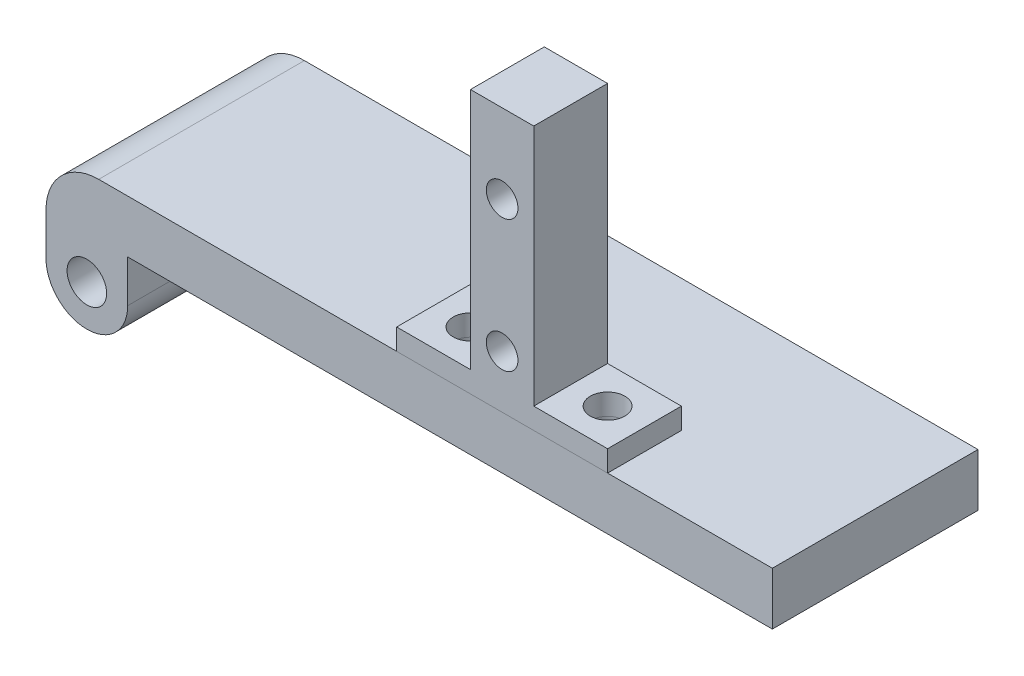
ISO-10303-21;
HEADER;
FILE_DESCRIPTION(('STEP AP214'),'2;1');
FILE_NAME('part.step','',(''),(''),'','','');
FILE_SCHEMA(('AUTOMOTIVE_DESIGN { 1 0 10303 214 1 1 1 1 }'));
ENDSEC;
DATA;
#1=APPLICATION_CONTEXT('core data for automotive mechanical design processes');
#2=APPLICATION_PROTOCOL_DEFINITION('international standard','automotive_design',2000,#1);
#3=PRODUCT_CONTEXT('',#1,'mechanical');
#4=PRODUCT('Part','Part','',(#3));
#5=PRODUCT_RELATED_PRODUCT_CATEGORY('part','',(#4));
#6=PRODUCT_DEFINITION_FORMATION('','',#4);
#7=PRODUCT_DEFINITION_CONTEXT('part definition',#1,'design');
#8=PRODUCT_DEFINITION('design','',#6,#7);
#9=PRODUCT_DEFINITION_SHAPE('','',#8);
#10=(LENGTH_UNIT() NAMED_UNIT(*) SI_UNIT(.MILLI.,.METRE.));
#11=(NAMED_UNIT(*) PLANE_ANGLE_UNIT() SI_UNIT($,.RADIAN.));
#12=(NAMED_UNIT(*) SI_UNIT($,.STERADIAN.) SOLID_ANGLE_UNIT());
#13=UNCERTAINTY_MEASURE_WITH_UNIT(LENGTH_MEASURE(1.E-05),#10,'distance_accuracy_value','');
#14=(GEOMETRIC_REPRESENTATION_CONTEXT(3) GLOBAL_UNCERTAINTY_ASSIGNED_CONTEXT((#13)) GLOBAL_UNIT_ASSIGNED_CONTEXT((#10,
#11,#12)) REPRESENTATION_CONTEXT('',''));
#15=CARTESIAN_POINT('',(0.,0.,0.));
#16=DIRECTION('',(0.,0.,1.));
#17=DIRECTION('',(1.,0.,0.));
#18=AXIS2_PLACEMENT_3D('',#15,#16,#17);
#19=CARTESIAN_POINT('',(-31.035625,3.175,24.765));
#20=DIRECTION('',(0.,1.,0.));
#21=DIRECTION('',(0.,0.,1.));
#22=AXIS2_PLACEMENT_3D('',#19,#20,#21);
#23=PLANE('',#22);
#24=DIRECTION('',(-1.,0.,0.));
#25=VECTOR('',#24,1.);
#26=CARTESIAN_POINT('',(50.0856250000001,3.175,24.765));
#27=LINE('',#26,#25);
#28=CARTESIAN_POINT('',(50.085625,3.175,24.765));
#29=VERTEX_POINT('',#28);
#30=CARTESIAN_POINT('',(-31.035625,3.175,24.765));
#31=VERTEX_POINT('',#30);
#32=EDGE_CURVE('E64',#29,#31,#27,.T.);
#33=ORIENTED_EDGE('',*,*,#32,.F.);
#34=DIRECTION('',(0.,0.,1.));
#35=VECTOR('',#34,1.);
#36=CARTESIAN_POINT('',(50.085625,3.175,0.));
#37=LINE('',#36,#35);
#38=CARTESIAN_POINT('',(50.085625,3.175,0.));
#39=VERTEX_POINT('',#38);
#40=EDGE_CURVE('E121',#39,#29,#37,.T.);
#41=ORIENTED_EDGE('',*,*,#40,.F.);
#42=DIRECTION('',(-1.,0.,0.));
#43=VECTOR('',#42,1.);
#44=CARTESIAN_POINT('',(-37.385625,3.175,0.));
#45=LINE('',#44,#43);
#46=CARTESIAN_POINT('',(-31.035625,3.175,0.));
#47=VERTEX_POINT('',#46);
#48=EDGE_CURVE('E108',#39,#47,#45,.T.);
#49=ORIENTED_EDGE('',*,*,#48,.T.);
#50=DIRECTION('',(0.,0.,-1.));
#51=VECTOR('',#50,1.);
#52=CARTESIAN_POINT('',(-31.035625,3.175,38.1));
#53=LINE('',#52,#51);
#54=EDGE_CURVE('E117',#47,#31,#53,.F.);
#55=ORIENTED_EDGE('',*,*,#54,.T.);
#56=EDGE_LOOP('',(#33,#41,#49,#55));
#57=FACE_BOUND('',#56,.T.);
#58=CARTESIAN_POINT('',(25.7968750000001,3.175,20.32));
#59=DIRECTION('',(0.,1.,0.));
#60=DIRECTION('',(0.,0.,1.));
#61=AXIS2_PLACEMENT_3D('',#58,#59,#60);
#62=CIRCLE('',#61,2.0828);
#63=CARTESIAN_POINT('',(25.7968750000001,3.175,22.4028));
#64=VERTEX_POINT('',#63);
#65=EDGE_CURVE('E50',#64,#64,#62,.F.);
#66=ORIENTED_EDGE('',*,*,#65,.T.);
#67=EDGE_LOOP('',(#66));
#68=FACE_BOUND('',#67,.T.);
#69=CARTESIAN_POINT('',(9.286875,3.175,20.32));
#70=DIRECTION('',(0.,1.,0.));
#71=DIRECTION('',(0.,0.,1.));
#72=AXIS2_PLACEMENT_3D('',#69,#70,#71);
#73=CIRCLE('',#72,2.0828);
#74=CARTESIAN_POINT('',(9.286875,3.175,22.4028));
#75=VERTEX_POINT('',#74);
#76=EDGE_CURVE('E126',#75,#75,#73,.F.);
#77=ORIENTED_EDGE('',*,*,#76,.T.);
#78=EDGE_LOOP('',(#77));
#79=FACE_BOUND('',#78,.T.);
#80=ADVANCED_FACE('F46',(#57,#68,#79),#23,.T.);
#81=CARTESIAN_POINT('',(-32.464375,-8.255,0.));
#82=DIRECTION('',(0.,0.,1.));
#83=DIRECTION('',(1.,0.,0.));
#84=AXIS2_PLACEMENT_3D('',#81,#82,#83);
#85=PLANE('',#84);
#86=DIRECTION('',(0.,-1.,0.));
#87=VECTOR('',#86,1.);
#88=CARTESIAN_POINT('',(-37.385625,-8.255,0.));
#89=LINE('',#88,#87);
#90=CARTESIAN_POINT('',(-37.385625,-3.175,0.));
#91=VERTEX_POINT('',#90);
#92=CARTESIAN_POINT('',(-37.385625,-8.255,0.));
#93=VERTEX_POINT('',#92);
#94=EDGE_CURVE('E112',#91,#93,#89,.T.);
#95=ORIENTED_EDGE('',*,*,#94,.F.);
#96=CARTESIAN_POINT('',(-31.035625,-3.175,0.));
#97=DIRECTION('',(0.,0.,1.));
#98=DIRECTION('',(1.,0.,0.));
#99=AXIS2_PLACEMENT_3D('',#96,#97,#98);
#100=CIRCLE('',#99,6.35);
#101=EDGE_CURVE('E103',#91,#47,#100,.F.);
#102=ORIENTED_EDGE('',*,*,#101,.T.);
#103=ORIENTED_EDGE('',*,*,#48,.F.);
#104=DIRECTION('',(0.,1.,0.));
#105=VECTOR('',#104,1.);
#106=CARTESIAN_POINT('',(50.085625,-3.175,0.));
#107=LINE('',#106,#105);
#108=CARTESIAN_POINT('',(50.085625,-3.175,0.));
#109=VERTEX_POINT('',#108);
#110=EDGE_CURVE('E150',#109,#39,#107,.T.);
#111=ORIENTED_EDGE('',*,*,#110,.F.);
#112=DIRECTION('',(1.,0.,0.));
#113=VECTOR('',#112,1.);
#114=CARTESIAN_POINT('',(-27.543125,-3.175,0.));
#115=LINE('',#114,#113);
#116=CARTESIAN_POINT('',(-27.543125,-3.175,0.));
#117=VERTEX_POINT('',#116);
#118=EDGE_CURVE('E137',#117,#109,#115,.T.);
#119=ORIENTED_EDGE('',*,*,#118,.F.);
#120=DIRECTION('',(0.,1.,0.));
#121=VECTOR('',#120,1.);
#122=CARTESIAN_POINT('',(-27.543125,-8.255,0.));
#123=LINE('',#122,#121);
#124=CARTESIAN_POINT('',(-27.543125,-8.255,0.));
#125=VERTEX_POINT('',#124);
#126=EDGE_CURVE('E140',#125,#117,#123,.T.);
#127=ORIENTED_EDGE('',*,*,#126,.F.);
#128=CARTESIAN_POINT('',(-32.464375,-8.255,0.));
#129=DIRECTION('',(0.,0.,1.));
#130=DIRECTION('',(1.,0.,0.));
#131=AXIS2_PLACEMENT_3D('',#128,#129,#130);
#132=CIRCLE('',#131,4.92125);
#133=EDGE_CURVE('E143',#93,#125,#132,.T.);
#134=ORIENTED_EDGE('',*,*,#133,.F.);
#135=EDGE_LOOP('',(#95,#102,#103,#111,#119,#127,#134));
#136=FACE_BOUND('',#135,.T.);
#137=CARTESIAN_POINT('',(-32.464375,-8.255,0.));
#138=DIRECTION('',(0.,0.,1.));
#139=DIRECTION('',(1.,0.,0.));
#140=AXIS2_PLACEMENT_3D('',#137,#138,#139);
#141=CIRCLE('',#140,2.38125);
#142=CARTESIAN_POINT('',(-34.845625,-8.255,0.));
#143=VERTEX_POINT('',#142);
#144=EDGE_CURVE('E122',#143,#143,#141,.T.);
#145=ORIENTED_EDGE('',*,*,#144,.T.);
#146=EDGE_LOOP('',(#145));
#147=FACE_BOUND('',#146,.T.);
#148=ADVANCED_FACE('F105',(#136,#147),#85,.F.);
#149=CARTESIAN_POINT('',(50.085625,0.,0.));
#150=DIRECTION('',(1.,0.,0.));
#151=DIRECTION('',(0.,0.,-1.));
#152=AXIS2_PLACEMENT_3D('',#149,#150,#151);
#153=PLANE('',#152);
#154=DIRECTION('',(0.,1.,0.));
#155=VECTOR('',#154,1.);
#156=CARTESIAN_POINT('',(50.085625,3.175,24.765));
#157=LINE('',#156,#155);
#158=CARTESIAN_POINT('',(50.085625,-3.175,24.765));
#159=VERTEX_POINT('',#158);
#160=EDGE_CURVE('E170',#159,#29,#157,.T.);
#161=ORIENTED_EDGE('',*,*,#160,.F.);
#162=DIRECTION('',(0.,0.,-1.));
#163=VECTOR('',#162,1.);
#164=CARTESIAN_POINT('',(50.085625,-3.175,38.1));
#165=LINE('',#164,#163);
#166=EDGE_CURVE('E152',#159,#109,#165,.T.);
#167=ORIENTED_EDGE('',*,*,#166,.T.);
#168=ORIENTED_EDGE('',*,*,#110,.T.);
#169=ORIENTED_EDGE('',*,*,#40,.T.);
#170=EDGE_LOOP('',(#161,#167,#168,#169));
#171=FACE_BOUND('',#170,.T.);
#172=ADVANCED_FACE('F178',(#171),#153,.T.);
#173=CARTESIAN_POINT('',(-27.543125,-3.175,38.1));
#174=DIRECTION('',(0.,1.,0.));
#175=DIRECTION('',(-1.,0.,0.));
#176=AXIS2_PLACEMENT_3D('',#173,#174,#175);
#177=PLANE('',#176);
#178=CARTESIAN_POINT('',(9.286875,-3.175,20.32));
#179=DIRECTION('',(0.,1.,0.));
#180=DIRECTION('',(-1.,0.,0.));
#181=AXIS2_PLACEMENT_3D('',#178,#179,#180);
#182=CIRCLE('',#181,2.0828);
#183=CARTESIAN_POINT('',(7.204075,-3.175,20.32));
#184=VERTEX_POINT('',#183);
#185=EDGE_CURVE('E157',#184,#184,#182,.T.);
#186=ORIENTED_EDGE('',*,*,#185,.T.);
#187=EDGE_LOOP('',(#186));
#188=FACE_BOUND('',#187,.T.);
#189=CARTESIAN_POINT('',(25.7968750000001,-3.175,20.32));
#190=DIRECTION('',(0.,1.,0.));
#191=DIRECTION('',(-1.,0.,0.));
#192=AXIS2_PLACEMENT_3D('',#189,#190,#191);
#193=CIRCLE('',#192,2.0828);
#194=CARTESIAN_POINT('',(23.7140750000001,-3.175,20.32));
#195=VERTEX_POINT('',#194);
#196=EDGE_CURVE('E154',#195,#195,#193,.T.);
#197=ORIENTED_EDGE('',*,*,#196,.T.);
#198=EDGE_LOOP('',(#197));
#199=FACE_BOUND('',#198,.T.);
#200=ORIENTED_EDGE('',*,*,#166,.F.);
#201=DIRECTION('',(1.,0.,0.));
#202=VECTOR('',#201,1.);
#203=CARTESIAN_POINT('',(-27.5431249999999,-3.175,24.765));
#204=LINE('',#203,#202);
#205=CARTESIAN_POINT('',(-27.543125,-3.175,24.765));
#206=VERTEX_POINT('',#205);
#207=EDGE_CURVE('E168',#206,#159,#204,.T.);
#208=ORIENTED_EDGE('',*,*,#207,.F.);
#209=DIRECTION('',(0.,0.,-1.));
#210=VECTOR('',#209,1.);
#211=CARTESIAN_POINT('',(-27.543125,-3.175,38.1));
#212=LINE('',#211,#210);
#213=EDGE_CURVE('E135',#206,#117,#212,.T.);
#214=ORIENTED_EDGE('',*,*,#213,.T.);
#215=ORIENTED_EDGE('',*,*,#118,.T.);
#216=EDGE_LOOP('',(#200,#208,#214,#215));
#217=FACE_BOUND('',#216,.T.);
#218=ADVANCED_FACE('F182',(#188,#199,#217),#177,.F.);
#219=CARTESIAN_POINT('',(25.7968750000001,-13.17625,20.32));
#220=DIRECTION('',(0.,1.,0.));
#221=DIRECTION('',(0.,0.,1.));
#222=AXIS2_PLACEMENT_3D('',#219,#220,#221);
#223=CYLINDRICAL_SURFACE('',#222,2.0828);
#224=ORIENTED_EDGE('',*,*,#196,.F.);
#225=EDGE_LOOP('',(#224));
#226=FACE_BOUND('',#225,.T.);
#227=ORIENTED_EDGE('',*,*,#65,.F.);
#228=EDGE_LOOP('',(#227));
#229=FACE_BOUND('',#228,.T.);
#230=ADVANCED_FACE('F217',(#226,#229),#223,.F.);
#231=CARTESIAN_POINT('',(9.286875,-13.17625,20.32));
#232=DIRECTION('',(0.,1.,0.));
#233=DIRECTION('',(0.,0.,1.));
#234=AXIS2_PLACEMENT_3D('',#231,#232,#233);
#235=CYLINDRICAL_SURFACE('',#234,2.0828);
#236=ORIENTED_EDGE('',*,*,#185,.F.);
#237=EDGE_LOOP('',(#236));
#238=FACE_BOUND('',#237,.T.);
#239=ORIENTED_EDGE('',*,*,#76,.F.);
#240=EDGE_LOOP('',(#239));
#241=FACE_BOUND('',#240,.T.);
#242=ADVANCED_FACE('F219',(#238,#241),#235,.F.);
#243=CARTESIAN_POINT('',(-27.543125,-8.255,38.1));
#244=DIRECTION('',(-1.,0.,0.));
#245=DIRECTION('',(0.,0.,1.));
#246=AXIS2_PLACEMENT_3D('',#243,#244,#245);
#247=PLANE('',#246);
#248=ORIENTED_EDGE('',*,*,#213,.F.);
#249=DIRECTION('',(0.,1.,0.));
#250=VECTOR('',#249,1.);
#251=CARTESIAN_POINT('',(-27.543125,-8.255,24.765));
#252=LINE('',#251,#250);
#253=CARTESIAN_POINT('',(-27.543125,-8.255,24.765));
#254=VERTEX_POINT('',#253);
#255=EDGE_CURVE('E166',#254,#206,#252,.T.);
#256=ORIENTED_EDGE('',*,*,#255,.F.);
#257=DIRECTION('',(0.,0.,-1.));
#258=VECTOR('',#257,1.);
#259=CARTESIAN_POINT('',(-27.543125,-8.255,38.1));
#260=LINE('',#259,#258);
#261=EDGE_CURVE('E133',#254,#125,#260,.T.);
#262=ORIENTED_EDGE('',*,*,#261,.T.);
#263=ORIENTED_EDGE('',*,*,#126,.T.);
#264=EDGE_LOOP('',(#248,#256,#262,#263));
#265=FACE_BOUND('',#264,.T.);
#266=ADVANCED_FACE('F186',(#265),#247,.F.);
#267=CARTESIAN_POINT('',(-32.464375,-8.255,38.1));
#268=DIRECTION('',(0.,0.,-1.));
#269=DIRECTION('',(-1.,0.,0.));
#270=AXIS2_PLACEMENT_3D('',#267,#268,#269);
#271=CYLINDRICAL_SURFACE('',#270,4.92125);
#272=ORIENTED_EDGE('',*,*,#261,.F.);
#273=CARTESIAN_POINT('',(-32.464375,-8.255,24.765));
#274=DIRECTION('',(0.,0.,-1.));
#275=DIRECTION('',(-1.,0.,0.));
#276=AXIS2_PLACEMENT_3D('',#273,#274,#275);
#277=CIRCLE('',#276,4.92125);
#278=CARTESIAN_POINT('',(-37.385625,-8.255,24.765));
#279=VERTEX_POINT('',#278);
#280=EDGE_CURVE('E164',#279,#254,#277,.F.);
#281=ORIENTED_EDGE('',*,*,#280,.F.);
#282=DIRECTION('',(0.,0.,-1.));
#283=VECTOR('',#282,1.);
#284=CARTESIAN_POINT('',(-37.385625,-8.255,38.1));
#285=LINE('',#284,#283);
#286=EDGE_CURVE('E131',#279,#93,#285,.T.);
#287=ORIENTED_EDGE('',*,*,#286,.T.);
#288=ORIENTED_EDGE('',*,*,#133,.T.);
#289=EDGE_LOOP('',(#272,#281,#287,#288));
#290=FACE_BOUND('',#289,.T.);
#291=ADVANCED_FACE('F190',(#290),#271,.T.);
#292=CARTESIAN_POINT('',(-37.385625,-8.255,38.1));
#293=DIRECTION('',(1.,0.,0.));
#294=DIRECTION('',(0.,0.,-1.));
#295=AXIS2_PLACEMENT_3D('',#292,#293,#294);
#296=PLANE('',#295);
#297=ORIENTED_EDGE('',*,*,#286,.F.);
#298=DIRECTION('',(0.,-1.,0.));
#299=VECTOR('',#298,1.);
#300=CARTESIAN_POINT('',(-37.385625,-3.175,24.765));
#301=LINE('',#300,#299);
#302=CARTESIAN_POINT('',(-37.385625,-3.175,24.765));
#303=VERTEX_POINT('',#302);
#304=EDGE_CURVE('E56',#303,#279,#301,.T.);
#305=ORIENTED_EDGE('',*,*,#304,.F.);
#306=DIRECTION('',(0.,0.,-1.));
#307=VECTOR('',#306,1.);
#308=CARTESIAN_POINT('',(-37.385625,-3.175,38.1));
#309=LINE('',#308,#307);
#310=EDGE_CURVE('E116',#303,#91,#309,.T.);
#311=ORIENTED_EDGE('',*,*,#310,.T.);
#312=ORIENTED_EDGE('',*,*,#94,.T.);
#313=EDGE_LOOP('',(#297,#305,#311,#312));
#314=FACE_BOUND('',#313,.T.);
#315=ADVANCED_FACE('F193',(#314),#296,.F.);
#316=CARTESIAN_POINT('',(-31.035625,-3.175,38.1));
#317=DIRECTION('',(0.,0.,-1.));
#318=DIRECTION('',(-1.,0.,0.));
#319=AXIS2_PLACEMENT_3D('',#316,#317,#318);
#320=CYLINDRICAL_SURFACE('',#319,6.35);
#321=CARTESIAN_POINT('',(-31.035625,-3.175,24.765));
#322=DIRECTION('',(0.,0.,-1.));
#323=DIRECTION('',(-1.,0.,0.));
#324=AXIS2_PLACEMENT_3D('',#321,#322,#323);
#325=CIRCLE('',#324,6.35);
#326=EDGE_CURVE('E13',#31,#303,#325,.F.);
#327=ORIENTED_EDGE('',*,*,#326,.F.);
#328=ORIENTED_EDGE('',*,*,#54,.F.);
#329=ORIENTED_EDGE('',*,*,#101,.F.);
#330=ORIENTED_EDGE('',*,*,#310,.F.);
#331=EDGE_LOOP('',(#327,#328,#329,#330));
#332=FACE_BOUND('',#331,.T.);
#333=ADVANCED_FACE('F125',(#332),#320,.T.);
#334=CARTESIAN_POINT('',(-32.464375,-8.255,38.1));
#335=DIRECTION('',(0.,0.,-1.));
#336=DIRECTION('',(-1.,0.,0.));
#337=AXIS2_PLACEMENT_3D('',#334,#335,#336);
#338=CYLINDRICAL_SURFACE('',#337,2.38125);
#339=CARTESIAN_POINT('',(-32.464375,-8.255,24.765));
#340=DIRECTION('',(0.,0.,-1.));
#341=DIRECTION('',(-1.,0.,0.));
#342=AXIS2_PLACEMENT_3D('',#339,#340,#341);
#343=CIRCLE('',#342,2.38125);
#344=CARTESIAN_POINT('',(-34.845625,-8.255,24.765));
#345=VERTEX_POINT('',#344);
#346=EDGE_CURVE('E160',#345,#345,#343,.T.);
#347=CARTESIAN_POINT('',(-34.845625,-8.255,24.765));
#348=CARTESIAN_POINT('',(-34.845625,-8.255,24.50703125));
#349=CARTESIAN_POINT('',(-34.845625,-8.255,24.2490625));
#350=CARTESIAN_POINT('',(-34.845625,-8.255,23.733125));
#351=CARTESIAN_POINT('',(-34.845625,-8.255,23.47515625));
#352=CARTESIAN_POINT('',(-34.845625,-8.255,22.95921875));
#353=CARTESIAN_POINT('',(-34.845625,-8.255,22.70125));
#354=CARTESIAN_POINT('',(-34.845625,-8.255,22.1853125));
#355=CARTESIAN_POINT('',(-34.845625,-8.255,21.92734375));
#356=CARTESIAN_POINT('',(-34.845625,-8.255,21.41140625));
#357=CARTESIAN_POINT('',(-34.845625,-8.255,21.1534375));
#358=CARTESIAN_POINT('',(-34.845625,-8.255,20.6375));
#359=CARTESIAN_POINT('',(-34.845625,-8.255,20.37953125));
#360=CARTESIAN_POINT('',(-34.845625,-8.255,19.86359375));
#361=CARTESIAN_POINT('',(-34.845625,-8.255,19.605625));
#362=CARTESIAN_POINT('',(-34.845625,-8.255,19.0896875));
#363=CARTESIAN_POINT('',(-34.845625,-8.255,18.83171875));
#364=CARTESIAN_POINT('',(-34.845625,-8.255,18.31578125));
#365=CARTESIAN_POINT('',(-34.845625,-8.255,18.0578125));
#366=CARTESIAN_POINT('',(-34.845625,-8.255,17.541875));
#367=CARTESIAN_POINT('',(-34.845625,-8.255,17.28390625));
#368=CARTESIAN_POINT('',(-34.845625,-8.255,16.76796875));
#369=CARTESIAN_POINT('',(-34.845625,-8.255,16.51));
#370=CARTESIAN_POINT('',(-34.845625,-8.255,15.9940625));
#371=CARTESIAN_POINT('',(-34.845625,-8.255,15.73609375));
#372=CARTESIAN_POINT('',(-34.845625,-8.255,15.22015625));
#373=CARTESIAN_POINT('',(-34.845625,-8.255,14.9621875));
#374=CARTESIAN_POINT('',(-34.845625,-8.255,14.44625));
#375=CARTESIAN_POINT('',(-34.845625,-8.255,14.18828125));
#376=CARTESIAN_POINT('',(-34.845625,-8.255,13.67234375));
#377=CARTESIAN_POINT('',(-34.845625,-8.255,13.414375));
#378=CARTESIAN_POINT('',(-34.845625,-8.255,12.8984375));
#379=CARTESIAN_POINT('',(-34.845625,-8.255,12.64046875));
#380=CARTESIAN_POINT('',(-34.845625,-8.255,12.12453125));
#381=CARTESIAN_POINT('',(-34.845625,-8.255,11.8665625));
#382=CARTESIAN_POINT('',(-34.845625,-8.255,11.350625));
#383=CARTESIAN_POINT('',(-34.845625,-8.255,11.09265625));
#384=CARTESIAN_POINT('',(-34.845625,-8.255,10.57671875));
#385=CARTESIAN_POINT('',(-34.845625,-8.255,10.31875));
#386=CARTESIAN_POINT('',(-34.845625,-8.255,9.80281250000001));
#387=CARTESIAN_POINT('',(-34.845625,-8.255,9.54484375000001));
#388=CARTESIAN_POINT('',(-34.845625,-8.255,9.02890625000001));
#389=CARTESIAN_POINT('',(-34.845625,-8.255,8.77093750000001));
#390=CARTESIAN_POINT('',(-34.845625,-8.255,8.25500000000001));
#391=CARTESIAN_POINT('',(-34.845625,-8.255,7.99703125000001));
#392=CARTESIAN_POINT('',(-34.845625,-8.255,7.48109375000001));
#393=CARTESIAN_POINT('',(-34.845625,-8.255,7.22312500000001));
#394=CARTESIAN_POINT('',(-34.845625,-8.255,6.70718750000001));
#395=CARTESIAN_POINT('',(-34.845625,-8.255,6.44921875000001));
#396=CARTESIAN_POINT('',(-34.845625,-8.255,5.93328125000001));
#397=CARTESIAN_POINT('',(-34.845625,-8.255,5.67531250000001));
#398=CARTESIAN_POINT('',(-34.845625,-8.255,5.15937500000001));
#399=CARTESIAN_POINT('',(-34.845625,-8.255,4.90140625000001));
#400=CARTESIAN_POINT('',(-34.845625,-8.255,4.38546875000001));
#401=CARTESIAN_POINT('',(-34.845625,-8.255,4.1275));
#402=CARTESIAN_POINT('',(-34.845625,-8.255,3.6115625));
#403=CARTESIAN_POINT('',(-34.845625,-8.255,3.35359375));
#404=CARTESIAN_POINT('',(-34.845625,-8.255,2.83765625000001));
#405=CARTESIAN_POINT('',(-34.845625,-8.255,2.57968750000001));
#406=CARTESIAN_POINT('',(-34.845625,-8.255,2.06375000000001));
#407=CARTESIAN_POINT('',(-34.845625,-8.255,1.80578125));
#408=CARTESIAN_POINT('',(-34.845625,-8.255,1.28984375));
#409=CARTESIAN_POINT('',(-34.845625,-8.255,1.031875));
#410=CARTESIAN_POINT('',(-34.845625,-8.255,0.515937499999998));
#411=CARTESIAN_POINT('',(-34.845625,-8.255,0.257968749999999));
#412=CARTESIAN_POINT('',(-34.845625,-8.255,0.));
#413=B_SPLINE_CURVE_WITH_KNOTS('',3,(#347,#348,#349,#350,#351,#352,#353,#354,#355,#356,#357,
#358,#359,#360,#361,#362,#363,#364,#365,#366,#367,#368,#369,#370,#371,#372,#373,#374,#375,#376,
#377,#378,#379,#380,#381,#382,#383,#384,#385,#386,#387,#388,#389,#390,#391,#392,#393,#394,#395,
#396,#397,#398,#399,#400,#401,#402,#403,#404,#405,#406,#407,#408,#409,#410,#411,#412),
.UNSPECIFIED.,.F.,.F.,(4,2,2,2,2,2,2,2,2,2,2,2,2,2,2,2,2,2,2,2,2,2,2,2,2,2,2,2,2,2,2,2,4),(0.,
0.773906250000005,1.5478125,2.32171875,3.095625,3.86953125000001,4.64343750000001,
5.41734375000001,6.19125000000001,6.96515625000001,7.73906250000001,8.51296875000001,
9.28687500000001,10.06078125,10.8346875,11.60859375,12.3825,13.15640625,13.9303125,14.70421875,
15.478125,16.25203125,17.0259375,17.79984375,18.57375,19.34765625,20.1215625,20.89546875,
21.669375,22.44328125,23.2171875,23.99109375,24.765),.UNSPECIFIED.);
#414=EDGE_CURVE('BSEAM200',#345,#143,#413,.T.);
#415=ORIENTED_EDGE('',*,*,#346,.F.);
#416=ORIENTED_EDGE('',*,*,#144,.F.);
#417=ORIENTED_EDGE('',*,*,#414,.T.);
#418=ORIENTED_EDGE('',*,*,#414,.F.);
#419=EDGE_LOOP('',(#415,#417,#416,#418));
#420=FACE_BOUND('',#419,.T.);
#421=ADVANCED_FACE('F200',(#420),#338,.F.);
#422=CARTESIAN_POINT('',(21.351875,34.925,24.765));
#423=DIRECTION('',(0.,0.,-1.));
#424=DIRECTION('',(-1.,0.,0.));
#425=AXIS2_PLACEMENT_3D('',#422,#423,#424);
#426=PLANE('',#425);
#427=ORIENTED_EDGE('',*,*,#346,.T.);
#428=EDGE_LOOP('',(#427));
#429=FACE_BOUND('',#428,.T.);
#430=ORIENTED_EDGE('',*,*,#160,.T.);
#431=ORIENTED_EDGE('',*,*,#32,.T.);
#432=ORIENTED_EDGE('',*,*,#326,.T.);
#433=ORIENTED_EDGE('',*,*,#304,.T.);
#434=ORIENTED_EDGE('',*,*,#280,.T.);
#435=ORIENTED_EDGE('',*,*,#255,.T.);
#436=ORIENTED_EDGE('',*,*,#207,.T.);
#437=EDGE_LOOP('',(#430,#431,#432,#433,#434,#435,#436));
#438=FACE_BOUND('',#437,.T.);
#439=ADVANCED_FACE('F48',(#429,#438),#426,.F.);
#440=CLOSED_SHELL('',(#80,#148,#172,#218,#230,#242,#266,#291,#315,#333,#421,#439));
#441=MANIFOLD_SOLID_BREP('B2',#440);
#442=CARTESIAN_POINT('',(-31.035625,3.175,24.765));
#443=DIRECTION('',(0.,1.,0.));
#444=DIRECTION('',(0.,0.,1.));
#445=AXIS2_PLACEMENT_3D('',#442,#443,#444);
#446=PLANE('',#445);
#447=CARTESIAN_POINT('',(9.286875,3.175,20.32));
#448=DIRECTION('',(0.,1.,0.));
#449=DIRECTION('',(0.,0.,1.));
#450=AXIS2_PLACEMENT_3D('',#447,#448,#449);
#451=CIRCLE('',#450,2.0828);
#452=CARTESIAN_POINT('',(9.286875,3.175,22.4028));
#453=VERTEX_POINT('',#452);
#454=EDGE_CURVE('E342',#453,#453,#451,.F.);
#455=ORIENTED_EDGE('',*,*,#454,.F.);
#456=EDGE_LOOP('',(#455));
#457=FACE_BOUND('',#456,.T.);
#458=CARTESIAN_POINT('',(25.7968750000001,3.175,20.32));
#459=DIRECTION('',(0.,1.,0.));
#460=DIRECTION('',(0.,0.,1.));
#461=AXIS2_PLACEMENT_3D('',#458,#459,#460);
#462=CIRCLE('',#461,2.0828);
#463=CARTESIAN_POINT('',(25.7968750000001,3.175,22.4028));
#464=VERTEX_POINT('',#463);
#465=EDGE_CURVE('E458',#464,#464,#462,.F.);
#466=ORIENTED_EDGE('',*,*,#465,.F.);
#467=EDGE_LOOP('',(#466));
#468=FACE_BOUND('',#467,.T.);
#469=DIRECTION('',(1.,0.,0.));
#470=VECTOR('',#469,1.);
#471=CARTESIAN_POINT('',(21.351875,3.175,24.765));
#472=LINE('',#471,#470);
#473=CARTESIAN_POINT('',(4.84187500000001,3.175,24.765));
#474=VERTEX_POINT('',#473);
#475=CARTESIAN_POINT('',(30.241875,3.175,24.765));
#476=VERTEX_POINT('',#475);
#477=EDGE_CURVE('E44',#474,#476,#472,.T.);
#478=ORIENTED_EDGE('',*,*,#477,.F.);
#479=DIRECTION('',(0.,0.,1.));
#480=VECTOR('',#479,1.);
#481=CARTESIAN_POINT('',(4.841875,3.175,24.765));
#482=LINE('',#481,#480);
#483=CARTESIAN_POINT('',(4.841875,3.175,15.875));
#484=VERTEX_POINT('',#483);
#485=EDGE_CURVE('E400',#484,#474,#482,.T.);
#486=ORIENTED_EDGE('',*,*,#485,.F.);
#487=DIRECTION('',(-1.,0.,0.));
#488=VECTOR('',#487,1.);
#489=CARTESIAN_POINT('',(21.351875,3.175,15.875));
#490=LINE('',#489,#488);
#491=CARTESIAN_POINT('',(30.241875,3.175,15.875));
#492=VERTEX_POINT('',#491);
#493=EDGE_CURVE('E436',#492,#484,#490,.T.);
#494=ORIENTED_EDGE('',*,*,#493,.F.);
#495=DIRECTION('',(0.,0.,-1.));
#496=VECTOR('',#495,1.);
#497=CARTESIAN_POINT('',(30.241875,3.175,24.765));
#498=LINE('',#497,#496);
#499=EDGE_CURVE('E410',#476,#492,#498,.T.);
#500=ORIENTED_EDGE('',*,*,#499,.F.);
#501=EDGE_LOOP('',(#478,#486,#494,#500));
#502=FACE_BOUND('',#501,.T.);
#503=ADVANCED_FACE('F335',(#457,#468,#502),#446,.F.);
#504=CARTESIAN_POINT('',(0.,34.925,0.));
#505=DIRECTION('',(0.,1.,0.));
#506=DIRECTION('',(0.,0.,1.));
#507=AXIS2_PLACEMENT_3D('',#504,#505,#506);
#508=PLANE('',#507);
#509=DIRECTION('',(0.,0.,1.));
#510=VECTOR('',#509,1.);
#511=CARTESIAN_POINT('',(13.731875,34.925,24.765));
#512=LINE('',#511,#510);
#513=CARTESIAN_POINT('',(13.731875,34.925,15.875));
#514=VERTEX_POINT('',#513);
#515=CARTESIAN_POINT('',(13.731875,34.925,24.765));
#516=VERTEX_POINT('',#515);
#517=EDGE_CURVE('E437',#514,#516,#512,.T.);
#518=ORIENTED_EDGE('',*,*,#517,.T.);
#519=DIRECTION('',(1.,0.,0.));
#520=VECTOR('',#519,1.);
#521=CARTESIAN_POINT('',(21.351875,34.925,24.765));
#522=LINE('',#521,#520);
#523=CARTESIAN_POINT('',(21.351875,34.925,24.765));
#524=VERTEX_POINT('',#523);
#525=EDGE_CURVE('E440',#516,#524,#522,.T.);
#526=ORIENTED_EDGE('',*,*,#525,.T.);
#527=DIRECTION('',(0.,0.,-1.));
#528=VECTOR('',#527,1.);
#529=CARTESIAN_POINT('',(21.351875,34.925,24.765));
#530=LINE('',#529,#528);
#531=CARTESIAN_POINT('',(21.351875,34.925,15.875));
#532=VERTEX_POINT('',#531);
#533=EDGE_CURVE('E442',#524,#532,#530,.T.);
#534=ORIENTED_EDGE('',*,*,#533,.T.);
#535=DIRECTION('',(-1.,0.,0.));
#536=VECTOR('',#535,1.);
#537=CARTESIAN_POINT('',(21.351875,34.925,15.875));
#538=LINE('',#537,#536);
#539=EDGE_CURVE('E444',#532,#514,#538,.T.);
#540=ORIENTED_EDGE('',*,*,#539,.T.);
#541=EDGE_LOOP('',(#518,#526,#534,#540));
#542=FACE_BOUND('',#541,.T.);
#543=ADVANCED_FACE('F477',(#542),#508,.T.);
#544=CARTESIAN_POINT('',(13.731875,34.925,24.765));
#545=DIRECTION('',(1.,0.,0.));
#546=DIRECTION('',(0.,0.,-1.));
#547=AXIS2_PLACEMENT_3D('',#544,#545,#546);
#548=PLANE('',#547);
#549=DIRECTION('',(0.,-1.,0.));
#550=VECTOR('',#549,1.);
#551=CARTESIAN_POINT('',(13.731875,34.925,15.875));
#552=LINE('',#551,#550);
#553=CARTESIAN_POINT('',(13.731875,5.715,15.875));
#554=VERTEX_POINT('',#553);
#555=EDGE_CURVE('E446',#514,#554,#552,.T.);
#556=ORIENTED_EDGE('',*,*,#555,.T.);
#557=DIRECTION('',(0.,0.,1.));
#558=VECTOR('',#557,1.);
#559=CARTESIAN_POINT('',(13.731875,5.715,24.765));
#560=LINE('',#559,#558);
#561=CARTESIAN_POINT('',(13.731875,5.715,24.765));
#562=VERTEX_POINT('',#561);
#563=EDGE_CURVE('E421',#554,#562,#560,.T.);
#564=ORIENTED_EDGE('',*,*,#563,.T.);
#565=DIRECTION('',(0.,-1.,0.));
#566=VECTOR('',#565,1.);
#567=CARTESIAN_POINT('',(13.731875,34.925,24.765));
#568=LINE('',#567,#566);
#569=EDGE_CURVE('E456',#516,#562,#568,.T.);
#570=ORIENTED_EDGE('',*,*,#569,.F.);
#571=ORIENTED_EDGE('',*,*,#517,.F.);
#572=EDGE_LOOP('',(#556,#564,#570,#571));
#573=FACE_BOUND('',#572,.T.);
#574=ADVANCED_FACE('F509',(#573),#548,.F.);
#575=CARTESIAN_POINT('',(21.351875,34.925,24.765));
#576=DIRECTION('',(-1.,0.,0.));
#577=DIRECTION('',(0.,0.,1.));
#578=AXIS2_PLACEMENT_3D('',#575,#576,#577);
#579=PLANE('',#578);
#580=DIRECTION('',(0.,-1.,0.));
#581=VECTOR('',#580,1.);
#582=CARTESIAN_POINT('',(21.351875,34.925,24.765));
#583=LINE('',#582,#581);
#584=CARTESIAN_POINT('',(21.351875,5.715,24.765));
#585=VERTEX_POINT('',#584);
#586=EDGE_CURVE('E453',#524,#585,#583,.T.);
#587=ORIENTED_EDGE('',*,*,#586,.T.);
#588=DIRECTION('',(0.,0.,-1.));
#589=VECTOR('',#588,1.);
#590=CARTESIAN_POINT('',(21.351875,5.715,24.765));
#591=LINE('',#590,#589);
#592=CARTESIAN_POINT('',(21.351875,5.715,15.875));
#593=VERTEX_POINT('',#592);
#594=EDGE_CURVE('E418',#585,#593,#591,.T.);
#595=ORIENTED_EDGE('',*,*,#594,.T.);
#596=DIRECTION('',(0.,-1.,0.));
#597=VECTOR('',#596,1.);
#598=CARTESIAN_POINT('',(21.351875,34.925,15.875));
#599=LINE('',#598,#597);
#600=EDGE_CURVE('E450',#532,#593,#599,.T.);
#601=ORIENTED_EDGE('',*,*,#600,.F.);
#602=ORIENTED_EDGE('',*,*,#533,.F.);
#603=EDGE_LOOP('',(#587,#595,#601,#602));
#604=FACE_BOUND('',#603,.T.);
#605=ADVANCED_FACE('F502',(#604),#579,.F.);
#606=CARTESIAN_POINT('',(17.541875,25.4,0.));
#607=DIRECTION('',(0.,0.,1.));
#608=DIRECTION('',(1.,0.,0.));
#609=AXIS2_PLACEMENT_3D('',#606,#607,#608);
#610=CYLINDRICAL_SURFACE('',#609,1.905);
#611=CARTESIAN_POINT('',(17.541875,25.4,15.875));
#612=DIRECTION('',(0.,0.,1.));
#613=DIRECTION('',(1.,0.,0.));
#614=AXIS2_PLACEMENT_3D('',#611,#612,#613);
#615=CIRCLE('',#614,1.905);
#616=CARTESIAN_POINT('',(19.446875,25.4,15.875));
#617=VERTEX_POINT('',#616);
#618=EDGE_CURVE('E428',#617,#617,#615,.T.);
#619=CARTESIAN_POINT('',(17.541875,25.4,24.765));
#620=DIRECTION('',(0.,0.,-1.));
#621=DIRECTION('',(-1.,0.,0.));
#622=AXIS2_PLACEMENT_3D('',#619,#620,#621);
#623=CIRCLE('',#622,1.905);
#624=CARTESIAN_POINT('',(19.446875,25.4,24.765));
#625=VERTEX_POINT('',#624);
#626=EDGE_CURVE('E429',#625,#625,#623,.T.);
#627=CARTESIAN_POINT('',(19.446875,25.4,15.875));
#628=CARTESIAN_POINT('',(19.446875,25.4,15.9676041666667));
#629=CARTESIAN_POINT('',(19.446875,25.4,16.0602083333333));
#630=CARTESIAN_POINT('',(19.446875,25.4,16.2454166666667));
#631=CARTESIAN_POINT('',(19.446875,25.4,16.3380208333333));
#632=CARTESIAN_POINT('',(19.446875,25.4,16.5232291666667));
#633=CARTESIAN_POINT('',(19.446875,25.4,16.6158333333333));
#634=CARTESIAN_POINT('',(19.446875,25.4,16.8010416666667));
#635=CARTESIAN_POINT('',(19.446875,25.4,16.8936458333333));
#636=CARTESIAN_POINT('',(19.446875,25.4,17.0788541666667));
#637=CARTESIAN_POINT('',(19.446875,25.4,17.1714583333333));
#638=CARTESIAN_POINT('',(19.446875,25.4,17.3566666666667));
#639=CARTESIAN_POINT('',(19.446875,25.4,17.4492708333333));
#640=CARTESIAN_POINT('',(19.446875,25.4,17.6344791666667));
#641=CARTESIAN_POINT('',(19.446875,25.4,17.7270833333333));
#642=CARTESIAN_POINT('',(19.446875,25.4,17.9122916666667));
#643=CARTESIAN_POINT('',(19.446875,25.4,18.0048958333333));
#644=CARTESIAN_POINT('',(19.446875,25.4,18.1901041666667));
#645=CARTESIAN_POINT('',(19.446875,25.4,18.2827083333333));
#646=CARTESIAN_POINT('',(19.446875,25.4,18.4679166666667));
#647=CARTESIAN_POINT('',(19.446875,25.4,18.5605208333333));
#648=CARTESIAN_POINT('',(19.446875,25.4,18.7457291666667));
#649=CARTESIAN_POINT('',(19.446875,25.4,18.8383333333333));
#650=CARTESIAN_POINT('',(19.446875,25.4,19.0235416666667));
#651=CARTESIAN_POINT('',(19.446875,25.4,19.1161458333333));
#652=CARTESIAN_POINT('',(19.446875,25.4,19.3013541666667));
#653=CARTESIAN_POINT('',(19.446875,25.4,19.3939583333333));
#654=CARTESIAN_POINT('',(19.446875,25.4,19.5791666666667));
#655=CARTESIAN_POINT('',(19.446875,25.4,19.6717708333333));
#656=CARTESIAN_POINT('',(19.446875,25.4,19.8569791666667));
#657=CARTESIAN_POINT('',(19.446875,25.4,19.9495833333333));
#658=CARTESIAN_POINT('',(19.446875,25.4,20.1347916666667));
#659=CARTESIAN_POINT('',(19.446875,25.4,20.2273958333333));
#660=CARTESIAN_POINT('',(19.446875,25.4,20.4126041666667));
#661=CARTESIAN_POINT('',(19.446875,25.4,20.5052083333333));
#662=CARTESIAN_POINT('',(19.446875,25.4,20.6904166666667));
#663=CARTESIAN_POINT('',(19.446875,25.4,20.7830208333333));
#664=CARTESIAN_POINT('',(19.446875,25.4,20.9682291666667));
#665=CARTESIAN_POINT('',(19.446875,25.4,21.0608333333333));
#666=CARTESIAN_POINT('',(19.446875,25.4,21.2460416666667));
#667=CARTESIAN_POINT('',(19.446875,25.4,21.3386458333333));
#668=CARTESIAN_POINT('',(19.446875,25.4,21.5238541666667));
#669=CARTESIAN_POINT('',(19.446875,25.4,21.6164583333333));
#670=CARTESIAN_POINT('',(19.446875,25.4,21.8016666666667));
#671=CARTESIAN_POINT('',(19.446875,25.4,21.8942708333333));
#672=CARTESIAN_POINT('',(19.446875,25.4,22.0794791666667));
#673=CARTESIAN_POINT('',(19.446875,25.4,22.1720833333333));
#674=CARTESIAN_POINT('',(19.446875,25.4,22.3572916666667));
#675=CARTESIAN_POINT('',(19.446875,25.4,22.4498958333333));
#676=CARTESIAN_POINT('',(19.446875,25.4,22.6351041666667));
#677=CARTESIAN_POINT('',(19.446875,25.4,22.7277083333333));
#678=CARTESIAN_POINT('',(19.446875,25.4,22.9129166666667));
#679=CARTESIAN_POINT('',(19.446875,25.4,23.0055208333333));
#680=CARTESIAN_POINT('',(19.446875,25.4,23.1907291666667));
#681=CARTESIAN_POINT('',(19.446875,25.4,23.2833333333333));
#682=CARTESIAN_POINT('',(19.446875,25.4,23.4685416666667));
#683=CARTESIAN_POINT('',(19.446875,25.4,23.5611458333333));
#684=CARTESIAN_POINT('',(19.446875,25.4,23.7463541666667));
#685=CARTESIAN_POINT('',(19.446875,25.4,23.8389583333333));
#686=CARTESIAN_POINT('',(19.446875,25.4,24.0241666666667));
#687=CARTESIAN_POINT('',(19.446875,25.4,24.1167708333333));
#688=CARTESIAN_POINT('',(19.446875,25.4,24.3019791666667));
#689=CARTESIAN_POINT('',(19.446875,25.4,24.3945833333333));
#690=CARTESIAN_POINT('',(19.446875,25.4,24.5797916666667));
#691=CARTESIAN_POINT('',(19.446875,25.4,24.6723958333333));
#692=CARTESIAN_POINT('',(19.446875,25.4,24.765));
#693=B_SPLINE_CURVE_WITH_KNOTS('',3,(#627,#628,#629,#630,#631,#632,#633,#634,#635,#636,#637,
#638,#639,#640,#641,#642,#643,#644,#645,#646,#647,#648,#649,#650,#651,#652,#653,#654,#655,#656,
#657,#658,#659,#660,#661,#662,#663,#664,#665,#666,#667,#668,#669,#670,#671,#672,#673,#674,#675,
#676,#677,#678,#679,#680,#681,#682,#683,#684,#685,#686,#687,#688,#689,#690,#691,#692),
.UNSPECIFIED.,.F.,.F.,(4,2,2,2,2,2,2,2,2,2,2,2,2,2,2,2,2,2,2,2,2,2,2,2,2,2,2,2,2,2,2,2,4),(0.,
0.277812499999999,0.555625000000001,0.833437499999999,1.11125,1.3890625,1.666875,1.9446875,
2.2225,2.5003125,2.778125,3.0559375,3.33375,3.6115625,3.889375,4.1671875,4.445,4.7228125,
5.000625,5.2784375,5.55625,5.8340625,6.111875,6.3896875,6.6675,6.94531249999999,7.223125,
7.5009375,7.77874999999999,8.0565625,8.33437499999999,8.61218749999999,8.89),.UNSPECIFIED.);
#694=EDGE_CURVE('BSEAM530',#617,#625,#693,.T.);
#695=ORIENTED_EDGE('',*,*,#618,.F.);
#696=ORIENTED_EDGE('',*,*,#626,.F.);
#697=ORIENTED_EDGE('',*,*,#694,.T.);
#698=ORIENTED_EDGE('',*,*,#694,.F.);
#699=EDGE_LOOP('',(#695,#697,#696,#698));
#700=FACE_BOUND('',#699,.T.);
#701=ADVANCED_FACE('F530',(#700),#610,.F.);
#702=CARTESIAN_POINT('',(17.541875,9.525,0.));
#703=DIRECTION('',(0.,0.,1.));
#704=DIRECTION('',(1.,0.,0.));
#705=AXIS2_PLACEMENT_3D('',#702,#703,#704);
#706=CYLINDRICAL_SURFACE('',#705,1.905);
#707=CARTESIAN_POINT('',(17.541875,9.525,15.875));
#708=DIRECTION('',(0.,0.,1.));
#709=DIRECTION('',(1.,0.,0.));
#710=AXIS2_PLACEMENT_3D('',#707,#708,#709);
#711=CIRCLE('',#710,1.905);
#712=CARTESIAN_POINT('',(19.446875,9.525,15.875));
#713=VERTEX_POINT('',#712);
#714=EDGE_CURVE('E432',#713,#713,#711,.T.);
#715=CARTESIAN_POINT('',(17.541875,9.525,24.765));
#716=DIRECTION('',(0.,0.,-1.));
#717=DIRECTION('',(-1.,0.,0.));
#718=AXIS2_PLACEMENT_3D('',#715,#716,#717);
#719=CIRCLE('',#718,1.905);
#720=CARTESIAN_POINT('',(19.446875,9.525,24.765));
#721=VERTEX_POINT('',#720);
#722=EDGE_CURVE('E433',#721,#721,#719,.T.);
#723=CARTESIAN_POINT('',(19.446875,9.525,15.875));
#724=CARTESIAN_POINT('',(19.446875,9.525,15.9676041666667));
#725=CARTESIAN_POINT('',(19.446875,9.525,16.0602083333333));
#726=CARTESIAN_POINT('',(19.446875,9.525,16.2454166666667));
#727=CARTESIAN_POINT('',(19.446875,9.525,16.3380208333333));
#728=CARTESIAN_POINT('',(19.446875,9.525,16.5232291666667));
#729=CARTESIAN_POINT('',(19.446875,9.525,16.6158333333333));
#730=CARTESIAN_POINT('',(19.446875,9.525,16.8010416666667));
#731=CARTESIAN_POINT('',(19.446875,9.525,16.8936458333333));
#732=CARTESIAN_POINT('',(19.446875,9.525,17.0788541666667));
#733=CARTESIAN_POINT('',(19.446875,9.525,17.1714583333333));
#734=CARTESIAN_POINT('',(19.446875,9.525,17.3566666666667));
#735=CARTESIAN_POINT('',(19.446875,9.525,17.4492708333333));
#736=CARTESIAN_POINT('',(19.446875,9.525,17.6344791666667));
#737=CARTESIAN_POINT('',(19.446875,9.525,17.7270833333333));
#738=CARTESIAN_POINT('',(19.446875,9.525,17.9122916666667));
#739=CARTESIAN_POINT('',(19.446875,9.525,18.0048958333333));
#740=CARTESIAN_POINT('',(19.446875,9.525,18.1901041666667));
#741=CARTESIAN_POINT('',(19.446875,9.525,18.2827083333333));
#742=CARTESIAN_POINT('',(19.446875,9.525,18.4679166666667));
#743=CARTESIAN_POINT('',(19.446875,9.525,18.5605208333333));
#744=CARTESIAN_POINT('',(19.446875,9.525,18.7457291666667));
#745=CARTESIAN_POINT('',(19.446875,9.525,18.8383333333333));
#746=CARTESIAN_POINT('',(19.446875,9.525,19.0235416666667));
#747=CARTESIAN_POINT('',(19.446875,9.525,19.1161458333333));
#748=CARTESIAN_POINT('',(19.446875,9.525,19.3013541666667));
#749=CARTESIAN_POINT('',(19.446875,9.525,19.3939583333333));
#750=CARTESIAN_POINT('',(19.446875,9.525,19.5791666666667));
#751=CARTESIAN_POINT('',(19.446875,9.525,19.6717708333333));
#752=CARTESIAN_POINT('',(19.446875,9.525,19.8569791666667));
#753=CARTESIAN_POINT('',(19.446875,9.525,19.9495833333333));
#754=CARTESIAN_POINT('',(19.446875,9.525,20.1347916666667));
#755=CARTESIAN_POINT('',(19.446875,9.525,20.2273958333333));
#756=CARTESIAN_POINT('',(19.446875,9.525,20.4126041666667));
#757=CARTESIAN_POINT('',(19.446875,9.525,20.5052083333333));
#758=CARTESIAN_POINT('',(19.446875,9.525,20.6904166666667));
#759=CARTESIAN_POINT('',(19.446875,9.525,20.7830208333333));
#760=CARTESIAN_POINT('',(19.446875,9.525,20.9682291666667));
#761=CARTESIAN_POINT('',(19.446875,9.525,21.0608333333333));
#762=CARTESIAN_POINT('',(19.446875,9.525,21.2460416666667));
#763=CARTESIAN_POINT('',(19.446875,9.525,21.3386458333333));
#764=CARTESIAN_POINT('',(19.446875,9.525,21.5238541666667));
#765=CARTESIAN_POINT('',(19.446875,9.525,21.6164583333333));
#766=CARTESIAN_POINT('',(19.446875,9.525,21.8016666666667));
#767=CARTESIAN_POINT('',(19.446875,9.525,21.8942708333333));
#768=CARTESIAN_POINT('',(19.446875,9.525,22.0794791666667));
#769=CARTESIAN_POINT('',(19.446875,9.525,22.1720833333333));
#770=CARTESIAN_POINT('',(19.446875,9.525,22.3572916666667));
#771=CARTESIAN_POINT('',(19.446875,9.525,22.4498958333333));
#772=CARTESIAN_POINT('',(19.446875,9.525,22.6351041666667));
#773=CARTESIAN_POINT('',(19.446875,9.525,22.7277083333333));
#774=CARTESIAN_POINT('',(19.446875,9.525,22.9129166666667));
#775=CARTESIAN_POINT('',(19.446875,9.525,23.0055208333333));
#776=CARTESIAN_POINT('',(19.446875,9.525,23.1907291666667));
#777=CARTESIAN_POINT('',(19.446875,9.525,23.2833333333333));
#778=CARTESIAN_POINT('',(19.446875,9.525,23.4685416666667));
#779=CARTESIAN_POINT('',(19.446875,9.525,23.5611458333333));
#780=CARTESIAN_POINT('',(19.446875,9.525,23.7463541666667));
#781=CARTESIAN_POINT('',(19.446875,9.525,23.8389583333333));
#782=CARTESIAN_POINT('',(19.446875,9.525,24.0241666666667));
#783=CARTESIAN_POINT('',(19.446875,9.525,24.1167708333333));
#784=CARTESIAN_POINT('',(19.446875,9.525,24.3019791666667));
#785=CARTESIAN_POINT('',(19.446875,9.525,24.3945833333333));
#786=CARTESIAN_POINT('',(19.446875,9.525,24.5797916666667));
#787=CARTESIAN_POINT('',(19.446875,9.525,24.6723958333333));
#788=CARTESIAN_POINT('',(19.446875,9.525,24.765));
#789=B_SPLINE_CURVE_WITH_KNOTS('',3,(#723,#724,#725,#726,#727,#728,#729,#730,#731,#732,#733,
#734,#735,#736,#737,#738,#739,#740,#741,#742,#743,#744,#745,#746,#747,#748,#749,#750,#751,#752,
#753,#754,#755,#756,#757,#758,#759,#760,#761,#762,#763,#764,#765,#766,#767,#768,#769,#770,#771,
#772,#773,#774,#775,#776,#777,#778,#779,#780,#781,#782,#783,#784,#785,#786,#787,#788),
.UNSPECIFIED.,.F.,.F.,(4,2,2,2,2,2,2,2,2,2,2,2,2,2,2,2,2,2,2,2,2,2,2,2,2,2,2,2,2,2,2,2,4),(0.,
0.277812499999999,0.555625000000001,0.833437499999999,1.11125,1.3890625,1.666875,1.9446875,
2.2225,2.5003125,2.778125,3.0559375,3.33375,3.6115625,3.889375,4.1671875,4.445,4.7228125,
5.000625,5.2784375,5.55625,5.8340625,6.111875,6.3896875,6.6675,6.94531249999999,7.223125,
7.5009375,7.77874999999999,8.0565625,8.33437499999999,8.61218749999999,8.89),.UNSPECIFIED.);
#790=EDGE_CURVE('BSEAM490',#713,#721,#789,.T.);
#791=ORIENTED_EDGE('',*,*,#714,.F.);
#792=ORIENTED_EDGE('',*,*,#722,.F.);
#793=ORIENTED_EDGE('',*,*,#790,.T.);
#794=ORIENTED_EDGE('',*,*,#790,.F.);
#795=EDGE_LOOP('',(#791,#793,#792,#794));
#796=FACE_BOUND('',#795,.T.);
#797=ADVANCED_FACE('F490',(#796),#706,.F.);
#798=CARTESIAN_POINT('',(0.,5.715,0.));
#799=DIRECTION('',(0.,1.,0.));
#800=DIRECTION('',(0.,0.,1.));
#801=AXIS2_PLACEMENT_3D('',#798,#799,#800);
#802=PLANE('',#801);
#803=CARTESIAN_POINT('',(25.7968750000001,5.715,20.32));
#804=DIRECTION('',(0.,1.,0.));
#805=DIRECTION('',(0.,0.,1.));
#806=AXIS2_PLACEMENT_3D('',#803,#804,#805);
#807=CIRCLE('',#806,2.0828);
#808=CARTESIAN_POINT('',(25.7968750000001,5.715,22.4028));
#809=VERTEX_POINT('',#808);
#810=EDGE_CURVE('E411',#809,#809,#807,.T.);
#811=ORIENTED_EDGE('',*,*,#810,.F.);
#812=EDGE_LOOP('',(#811));
#813=FACE_BOUND('',#812,.T.);
#814=ORIENTED_EDGE('',*,*,#594,.F.);
#815=DIRECTION('',(1.,0.,0.));
#816=VECTOR('',#815,1.);
#817=CARTESIAN_POINT('',(30.241875,5.715,24.765));
#818=LINE('',#817,#816);
#819=CARTESIAN_POINT('',(30.241875,5.715,24.765));
#820=VERTEX_POINT('',#819);
#821=EDGE_CURVE('E494',#585,#820,#818,.T.);
#822=ORIENTED_EDGE('',*,*,#821,.T.);
#823=DIRECTION('',(0.,0.,-1.));
#824=VECTOR('',#823,1.);
#825=CARTESIAN_POINT('',(30.241875,5.715,24.765));
#826=LINE('',#825,#824);
#827=CARTESIAN_POINT('',(30.241875,5.715,15.875));
#828=VERTEX_POINT('',#827);
#829=EDGE_CURVE('E513',#820,#828,#826,.T.);
#830=ORIENTED_EDGE('',*,*,#829,.T.);
#831=DIRECTION('',(-1.,0.,0.));
#832=VECTOR('',#831,1.);
#833=CARTESIAN_POINT('',(30.241875,5.715,15.875));
#834=LINE('',#833,#832);
#835=EDGE_CURVE('E357',#828,#593,#834,.T.);
#836=ORIENTED_EDGE('',*,*,#835,.T.);
#837=EDGE_LOOP('',(#814,#822,#830,#836));
#838=FACE_BOUND('',#837,.T.);
#839=ADVANCED_FACE('F485',(#813,#838),#802,.T.);
#840=CARTESIAN_POINT('',(25.7968750000001,-13.17625,20.32));
#841=DIRECTION('',(0.,1.,0.));
#842=DIRECTION('',(0.,0.,1.));
#843=AXIS2_PLACEMENT_3D('',#840,#841,#842);
#844=CYLINDRICAL_SURFACE('',#843,2.0828);
#845=ORIENTED_EDGE('',*,*,#465,.T.);
#846=EDGE_LOOP('',(#845));
#847=FACE_BOUND('',#846,.T.);
#848=ORIENTED_EDGE('',*,*,#810,.T.);
#849=EDGE_LOOP('',(#848));
#850=FACE_BOUND('',#849,.T.);
#851=ADVANCED_FACE('F481',(#847,#850),#844,.F.);
#852=CARTESIAN_POINT('',(21.351875,34.925,15.875));
#853=DIRECTION('',(0.,0.,1.));
#854=DIRECTION('',(1.,0.,0.));
#855=AXIS2_PLACEMENT_3D('',#852,#853,#854);
#856=PLANE('',#855);
#857=ORIENTED_EDGE('',*,*,#714,.T.);
#858=EDGE_LOOP('',(#857));
#859=FACE_BOUND('',#858,.T.);
#860=ORIENTED_EDGE('',*,*,#618,.T.);
#861=EDGE_LOOP('',(#860));
#862=FACE_BOUND('',#861,.T.);
#863=ORIENTED_EDGE('',*,*,#600,.T.);
#864=ORIENTED_EDGE('',*,*,#835,.F.);
#865=DIRECTION('',(0.,-1.,0.));
#866=VECTOR('',#865,1.);
#867=CARTESIAN_POINT('',(30.241875,5.715,15.875));
#868=LINE('',#867,#866);
#869=EDGE_CURVE('E423',#828,#492,#868,.T.);
#870=ORIENTED_EDGE('',*,*,#869,.T.);
#871=ORIENTED_EDGE('',*,*,#493,.T.);
#872=DIRECTION('',(0.,-1.,0.));
#873=VECTOR('',#872,1.);
#874=CARTESIAN_POINT('',(4.841875,5.715,15.875));
#875=LINE('',#874,#873);
#876=CARTESIAN_POINT('',(4.841875,5.715,15.875));
#877=VERTEX_POINT('',#876);
#878=EDGE_CURVE('E407',#877,#484,#875,.T.);
#879=ORIENTED_EDGE('',*,*,#878,.F.);
#880=EDGE_CURVE('E511',#554,#877,#834,.T.);
#881=ORIENTED_EDGE('',*,*,#880,.F.);
#882=ORIENTED_EDGE('',*,*,#555,.F.);
#883=ORIENTED_EDGE('',*,*,#539,.F.);
#884=EDGE_LOOP('',(#863,#864,#870,#871,#879,#881,#882,#883));
#885=FACE_BOUND('',#884,.T.);
#886=ADVANCED_FACE('F484',(#859,#862,#885),#856,.F.);
#887=CARTESIAN_POINT('',(9.286875,5.715,20.32));
#888=DIRECTION('',(0.,1.,0.));
#889=DIRECTION('',(0.,0.,1.));
#890=AXIS2_PLACEMENT_3D('',#887,#888,#889);
#891=CIRCLE('',#890,2.0828);
#892=CARTESIAN_POINT('',(9.286875,5.715,22.4028));
#893=VERTEX_POINT('',#892);
#894=EDGE_CURVE('E463',#893,#893,#891,.T.);
#895=ORIENTED_EDGE('',*,*,#894,.F.);
#896=EDGE_LOOP('',(#895));
#897=FACE_BOUND('',#896,.T.);
#898=ORIENTED_EDGE('',*,*,#563,.F.);
#899=ORIENTED_EDGE('',*,*,#880,.T.);
#900=DIRECTION('',(0.,0.,1.));
#901=VECTOR('',#900,1.);
#902=CARTESIAN_POINT('',(4.841875,5.715,24.765));
#903=LINE('',#902,#901);
#904=CARTESIAN_POINT('',(4.841875,5.715,24.765));
#905=VERTEX_POINT('',#904);
#906=EDGE_CURVE('E500',#877,#905,#903,.T.);
#907=ORIENTED_EDGE('',*,*,#906,.T.);
#908=EDGE_CURVE('E349',#905,#562,#818,.T.);
#909=ORIENTED_EDGE('',*,*,#908,.T.);
#910=EDGE_LOOP('',(#898,#899,#907,#909));
#911=FACE_BOUND('',#910,.T.);
#912=ADVANCED_FACE('F492',(#897,#911),#802,.T.);
#913=CARTESIAN_POINT('',(9.286875,-13.17625,20.32));
#914=DIRECTION('',(0.,1.,0.));
#915=DIRECTION('',(0.,0.,1.));
#916=AXIS2_PLACEMENT_3D('',#913,#914,#915);
#917=CYLINDRICAL_SURFACE('',#916,2.0828);
#918=ORIENTED_EDGE('',*,*,#454,.T.);
#919=EDGE_LOOP('',(#918));
#920=FACE_BOUND('',#919,.T.);
#921=ORIENTED_EDGE('',*,*,#894,.T.);
#922=EDGE_LOOP('',(#921));
#923=FACE_BOUND('',#922,.T.);
#924=ADVANCED_FACE('F472',(#920,#923),#917,.F.);
#925=CARTESIAN_POINT('',(21.351875,34.925,24.765));
#926=DIRECTION('',(0.,0.,-1.));
#927=DIRECTION('',(-1.,0.,0.));
#928=AXIS2_PLACEMENT_3D('',#925,#926,#927);
#929=PLANE('',#928);
#930=ORIENTED_EDGE('',*,*,#722,.T.);
#931=EDGE_LOOP('',(#930));
#932=FACE_BOUND('',#931,.T.);
#933=ORIENTED_EDGE('',*,*,#626,.T.);
#934=EDGE_LOOP('',(#933));
#935=FACE_BOUND('',#934,.T.);
#936=DIRECTION('',(0.,-1.,0.));
#937=VECTOR('',#936,1.);
#938=CARTESIAN_POINT('',(4.841875,5.715,24.765));
#939=LINE('',#938,#937);
#940=EDGE_CURVE('E405',#905,#474,#939,.T.);
#941=ORIENTED_EDGE('',*,*,#940,.T.);
#942=ORIENTED_EDGE('',*,*,#477,.T.);
#943=DIRECTION('',(0.,-1.,0.));
#944=VECTOR('',#943,1.);
#945=CARTESIAN_POINT('',(30.241875,5.715,24.765));
#946=LINE('',#945,#944);
#947=EDGE_CURVE('E419',#820,#476,#946,.T.);
#948=ORIENTED_EDGE('',*,*,#947,.F.);
#949=ORIENTED_EDGE('',*,*,#821,.F.);
#950=ORIENTED_EDGE('',*,*,#586,.F.);
#951=ORIENTED_EDGE('',*,*,#525,.F.);
#952=ORIENTED_EDGE('',*,*,#569,.T.);
#953=ORIENTED_EDGE('',*,*,#908,.F.);
#954=EDGE_LOOP('',(#941,#942,#948,#949,#950,#951,#952,#953));
#955=FACE_BOUND('',#954,.T.);
#956=ADVANCED_FACE('F416',(#932,#935,#955),#929,.F.);
#957=CARTESIAN_POINT('',(4.841875,5.715,24.765));
#958=DIRECTION('',(1.,0.,0.));
#959=DIRECTION('',(0.,0.,-1.));
#960=AXIS2_PLACEMENT_3D('',#957,#958,#959);
#961=PLANE('',#960);
#962=ORIENTED_EDGE('',*,*,#485,.T.);
#963=ORIENTED_EDGE('',*,*,#940,.F.);
#964=ORIENTED_EDGE('',*,*,#906,.F.);
#965=ORIENTED_EDGE('',*,*,#878,.T.);
#966=EDGE_LOOP('',(#962,#963,#964,#965));
#967=FACE_BOUND('',#966,.T.);
#968=ADVANCED_FACE('F402',(#967),#961,.F.);
#969=CARTESIAN_POINT('',(30.241875,5.715,24.765));
#970=DIRECTION('',(-1.,0.,0.));
#971=DIRECTION('',(0.,0.,1.));
#972=AXIS2_PLACEMENT_3D('',#969,#970,#971);
#973=PLANE('',#972);
#974=ORIENTED_EDGE('',*,*,#499,.T.);
#975=ORIENTED_EDGE('',*,*,#869,.F.);
#976=ORIENTED_EDGE('',*,*,#829,.F.);
#977=ORIENTED_EDGE('',*,*,#947,.T.);
#978=EDGE_LOOP('',(#974,#975,#976,#977));
#979=FACE_BOUND('',#978,.T.);
#980=ADVANCED_FACE('F478',(#979),#973,.F.);
#981=CLOSED_SHELL('',(#503,#543,#574,#605,#701,#797,#839,#851,#886,#912,#924,#956,#968,#980));
#982=MANIFOLD_SOLID_BREP('B7',#981);
#983=ADVANCED_BREP_SHAPE_REPRESENTATION('',(#18,#441,#982),#14);
#984=SHAPE_DEFINITION_REPRESENTATION(#9,#983);
ENDSEC;
END-ISO-10303-21;
